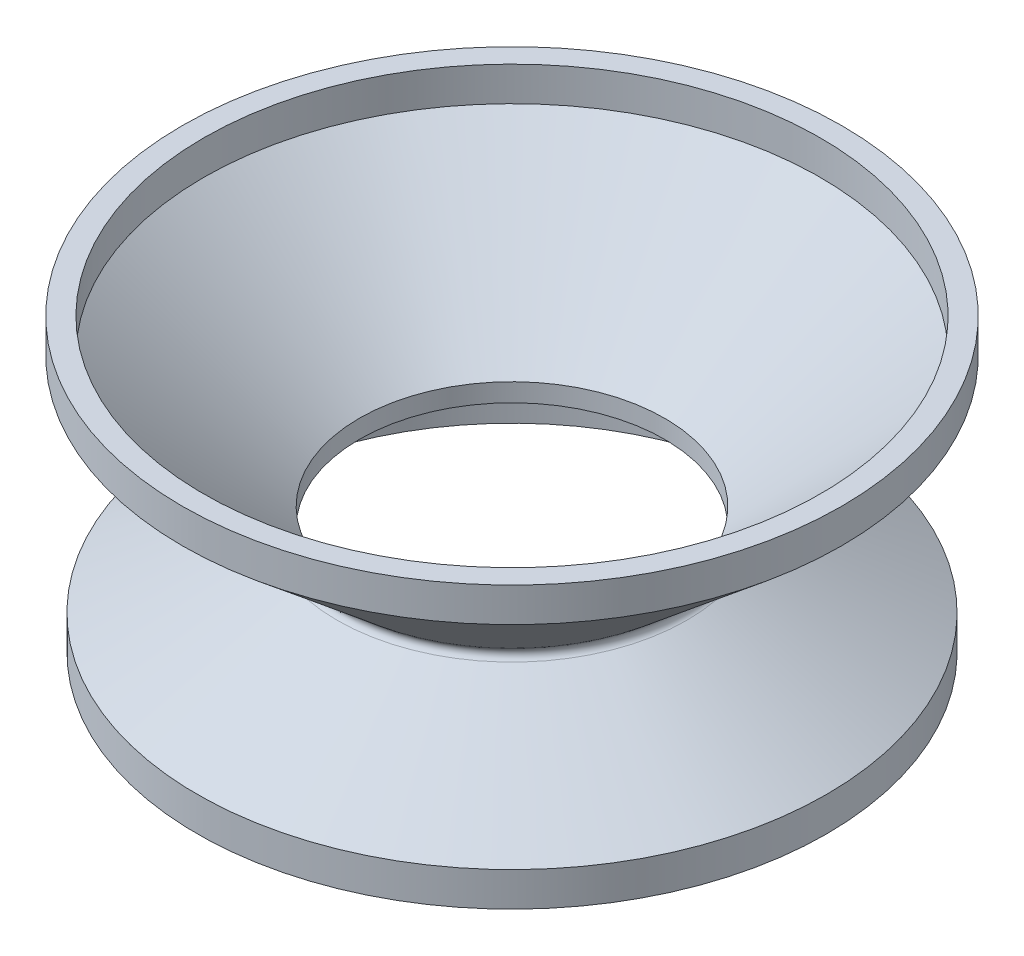
ISO-10303-21;
HEADER;
FILE_DESCRIPTION(('STEP AP214'),'2;1');
FILE_NAME('part.step','',(''),(''),'','','');
FILE_SCHEMA(('AUTOMOTIVE_DESIGN { 1 0 10303 214 1 1 1 1 }'));
ENDSEC;
DATA;
#1=APPLICATION_CONTEXT('core data for automotive mechanical design processes');
#2=APPLICATION_PROTOCOL_DEFINITION('international standard','automotive_design',2000,#1);
#3=PRODUCT_CONTEXT('',#1,'mechanical');
#4=PRODUCT('Part','Part','',(#3));
#5=PRODUCT_RELATED_PRODUCT_CATEGORY('part','',(#4));
#6=PRODUCT_DEFINITION_FORMATION('','',#4);
#7=PRODUCT_DEFINITION_CONTEXT('part definition',#1,'design');
#8=PRODUCT_DEFINITION('design','',#6,#7);
#9=PRODUCT_DEFINITION_SHAPE('','',#8);
#10=(LENGTH_UNIT() NAMED_UNIT(*) SI_UNIT(.MILLI.,.METRE.));
#11=(NAMED_UNIT(*) PLANE_ANGLE_UNIT() SI_UNIT($,.RADIAN.));
#12=(NAMED_UNIT(*) SI_UNIT($,.STERADIAN.) SOLID_ANGLE_UNIT());
#13=UNCERTAINTY_MEASURE_WITH_UNIT(LENGTH_MEASURE(1.E-05),#10,'distance_accuracy_value','');
#14=(GEOMETRIC_REPRESENTATION_CONTEXT(3) GLOBAL_UNCERTAINTY_ASSIGNED_CONTEXT((#13)) GLOBAL_UNIT_ASSIGNED_CONTEXT((#10,
#11,#12)) REPRESENTATION_CONTEXT('',''));
#15=CARTESIAN_POINT('',(0.,0.,0.));
#16=DIRECTION('',(0.,0.,1.));
#17=DIRECTION('',(1.,0.,0.));
#18=AXIS2_PLACEMENT_3D('',#15,#16,#17);
#19=CARTESIAN_POINT('',(10.3733322733685,0.,0.));
#20=DIRECTION('',(0.,-1.,0.));
#21=DIRECTION('',(1.,0.,0.));
#22=AXIS2_PLACEMENT_3D('',#19,#20,#21);
#23=CONICAL_SURFACE('',#22,9.71055032073455,1.0471975511966);
#24=CARTESIAN_POINT('',(10.3733322733685,-0.285629601348422,0.));
#25=DIRECTION('',(0.,-1.,0.));
#26=DIRECTION('',(1.,0.,0.));
#27=AXIS2_PLACEMENT_3D('',#24,#25,#26);
#28=CIRCLE('',#27,10.2052753024157);
#29=CARTESIAN_POINT('',(20.5786075757842,-0.28562960134842,0.));
#30=VERTEX_POINT('',#29);
#31=EDGE_CURVE('E10',#30,#30,#28,.T.);
#32=ORIENTED_EDGE('',*,*,#31,.T.);
#33=EDGE_LOOP('',(#32));
#34=FACE_BOUND('',#33,.T.);
#35=CARTESIAN_POINT('',(10.3733322733685,-5.,0.));
#36=DIRECTION('',(0.,-1.,0.));
#37=DIRECTION('',(1.,0.,0.));
#38=AXIS2_PLACEMENT_3D('',#35,#36,#37);
#39=CIRCLE('',#38,18.3708043585791);
#40=CARTESIAN_POINT('',(28.7441366319476,-5.,0.));
#41=VERTEX_POINT('',#40);
#42=EDGE_CURVE('E88',#41,#41,#39,.T.);
#43=ORIENTED_EDGE('',*,*,#42,.F.);
#44=EDGE_LOOP('',(#43));
#45=FACE_BOUND('',#44,.T.);
#46=ADVANCED_FACE('F43',(#34,#45),#23,.T.);
#47=CARTESIAN_POINT('',(10.3733322733685,8.,0.));
#48=DIRECTION('',(0.,1.,0.));
#49=DIRECTION('',(-1.,0.,0.));
#50=AXIS2_PLACEMENT_3D('',#47,#48,#49);
#51=CONICAL_SURFACE('',#50,19.2445790614883,0.87266462599717);
#52=CARTESIAN_POINT('',(10.3733322733685,0.367198337412949,0.));
#53=DIRECTION('',(0.,1.,0.));
#54=DIRECTION('',(-1.,0.,0.));
#55=AXIS2_PLACEMENT_3D('',#52,#53,#54);
#56=CIRCLE('',#55,10.148160258541);
#57=CARTESIAN_POINT('',(0.225172014827461,0.367198337412948,0.));
#58=VERTEX_POINT('',#57);
#59=EDGE_CURVE('E51',#58,#58,#56,.T.);
#60=ORIENTED_EDGE('',*,*,#59,.T.);
#61=EDGE_LOOP('',(#60));
#62=FACE_BOUND('',#61,.T.);
#63=CARTESIAN_POINT('',(10.3733322733685,8.,0.));
#64=DIRECTION('',(0.,1.,0.));
#65=DIRECTION('',(-1.,0.,0.));
#66=AXIS2_PLACEMENT_3D('',#63,#64,#65);
#67=CIRCLE('',#66,19.2445790614883);
#68=CARTESIAN_POINT('',(-8.87124678811982,8.,0.));
#69=VERTEX_POINT('',#68);
#70=EDGE_CURVE('E56',#69,#69,#67,.T.);
#71=ORIENTED_EDGE('',*,*,#70,.F.);
#72=EDGE_LOOP('',(#71));
#73=FACE_BOUND('',#72,.T.);
#74=ADVANCED_FACE('F120',(#62,#73),#51,.T.);
#75=CARTESIAN_POINT('',(10.3733322733685,0.373046126524003,0.));
#76=DIRECTION('',(0.,1.,0.));
#77=DIRECTION('',(-1.,0.,0.));
#78=AXIS2_PLACEMENT_3D('',#75,#76,#77);
#79=CONICAL_SURFACE('',#78,8.91055032073455,0.872664625997171);
#80=CARTESIAN_POINT('',(10.3733322733685,8.,0.));
#81=DIRECTION('',(0.,1.,0.));
#82=DIRECTION('',(-1.,0.,0.));
#83=AXIS2_PLACEMENT_3D('',#80,#81,#82);
#84=CIRCLE('',#83,18.);
#85=CARTESIAN_POINT('',(-7.62666772663149,8.,0.));
#86=VERTEX_POINT('',#85);
#87=EDGE_CURVE('E80',#86,#86,#84,.T.);
#88=ORIENTED_EDGE('',*,*,#87,.T.);
#89=EDGE_LOOP('',(#88));
#90=FACE_BOUND('',#89,.T.);
#91=CARTESIAN_POINT('',(10.3733322733685,0.373046126524003,0.));
#92=DIRECTION('',(0.,1.,0.));
#93=DIRECTION('',(-1.,0.,0.));
#94=AXIS2_PLACEMENT_3D('',#91,#92,#93);
#95=CIRCLE('',#94,8.91055032073455);
#96=CARTESIAN_POINT('',(1.46278195263397,0.373046126524002,0.));
#97=VERTEX_POINT('',#96);
#98=EDGE_CURVE('E61',#97,#97,#95,.T.);
#99=ORIENTED_EDGE('',*,*,#98,.F.);
#100=EDGE_LOOP('',(#99));
#101=FACE_BOUND('',#100,.T.);
#102=ADVANCED_FACE('F125',(#90,#101),#79,.F.);
#103=CARTESIAN_POINT('',(10.3733322733685,7.60901803281972,0.));
#104=DIRECTION('',(0.,1.,0.));
#105=DIRECTION('',(-1.,0.,0.));
#106=AXIS2_PLACEMENT_3D('',#103,#104,#105);
#107=CYLINDRICAL_SURFACE('',#106,8.91055032073455);
#108=ORIENTED_EDGE('',*,*,#98,.T.);
#109=EDGE_LOOP('',(#108));
#110=FACE_BOUND('',#109,.T.);
#111=CARTESIAN_POINT('',(10.3733322733685,-0.692820323027551,0.));
#112=DIRECTION('',(0.,1.,0.));
#113=DIRECTION('',(-1.,0.,0.));
#114=AXIS2_PLACEMENT_3D('',#111,#112,#113);
#115=CIRCLE('',#114,8.91055032073455);
#116=CARTESIAN_POINT('',(1.46278195263397,-0.692820323027552,0.));
#117=VERTEX_POINT('',#116);
#118=EDGE_CURVE('E67',#117,#117,#115,.T.);
#119=ORIENTED_EDGE('',*,*,#118,.F.);
#120=EDGE_LOOP('',(#119));
#121=FACE_BOUND('',#120,.T.);
#122=ADVANCED_FACE('F131',(#110,#121),#107,.F.);
#123=CARTESIAN_POINT('',(10.3733322733685,-5.,0.));
#124=DIRECTION('',(0.,-1.,0.));
#125=DIRECTION('',(1.,0.,0.));
#126=AXIS2_PLACEMENT_3D('',#123,#124,#125);
#127=CONICAL_SURFACE('',#126,16.370804358579,1.0471975511966);
#128=ORIENTED_EDGE('',*,*,#118,.T.);
#129=EDGE_LOOP('',(#128));
#130=FACE_BOUND('',#129,.T.);
#131=CARTESIAN_POINT('',(10.3733322733685,-5.,0.));
#132=DIRECTION('',(0.,1.,0.));
#133=DIRECTION('',(-1.,0.,0.));
#134=AXIS2_PLACEMENT_3D('',#131,#132,#133);
#135=CIRCLE('',#134,16.370804358579);
#136=CARTESIAN_POINT('',(-5.99747208521052,-5.,0.));
#137=VERTEX_POINT('',#136);
#138=EDGE_CURVE('E71',#137,#137,#135,.T.);
#139=ORIENTED_EDGE('',*,*,#138,.F.);
#140=EDGE_LOOP('',(#139));
#141=FACE_BOUND('',#140,.T.);
#142=ADVANCED_FACE('F135',(#130,#141),#127,.F.);
#143=CARTESIAN_POINT('',(10.3733322733685,0.0607805601653549,0.));
#144=DIRECTION('',(0.,1.,0.));
#145=DIRECTION('',(-1.,0.,0.));
#146=AXIS2_PLACEMENT_3D('',#143,#144,#145);
#147=TOROIDAL_SURFACE('',#146,10.4052753024157,0.4);
#148=ORIENTED_EDGE('',*,*,#31,.F.);
#149=EDGE_LOOP('',(#148));
#150=FACE_BOUND('',#149,.T.);
#151=ORIENTED_EDGE('',*,*,#59,.F.);
#152=EDGE_LOOP('',(#151));
#153=FACE_BOUND('',#152,.T.);
#154=ADVANCED_FACE('F45',(#150,#153),#147,.F.);
#155=CARTESIAN_POINT('',(10.3733322733685,10.,0.));
#156=DIRECTION('',(0.,1.,0.));
#157=DIRECTION('',(-1.,0.,0.));
#158=AXIS2_PLACEMENT_3D('',#155,#156,#157);
#159=PLANE('',#158);
#160=CARTESIAN_POINT('',(10.3733322733685,10.,0.));
#161=DIRECTION('',(0.,1.,0.));
#162=DIRECTION('',(-1.,0.,0.));
#163=AXIS2_PLACEMENT_3D('',#160,#161,#162);
#164=CIRCLE('',#163,19.2445790614883);
#165=CARTESIAN_POINT('',(-8.87124678811982,10.,0.));
#166=VERTEX_POINT('',#165);
#167=EDGE_CURVE('E75',#166,#166,#164,.T.);
#168=ORIENTED_EDGE('',*,*,#167,.T.);
#169=EDGE_LOOP('',(#168));
#170=FACE_BOUND('',#169,.T.);
#171=CARTESIAN_POINT('',(10.3733322733685,10.,0.));
#172=DIRECTION('',(0.,1.,0.));
#173=DIRECTION('',(-1.,0.,0.));
#174=AXIS2_PLACEMENT_3D('',#171,#172,#173);
#175=CIRCLE('',#174,18.);
#176=CARTESIAN_POINT('',(-7.62666772663149,10.,0.));
#177=VERTEX_POINT('',#176);
#178=EDGE_CURVE('E79',#177,#177,#175,.T.);
#179=ORIENTED_EDGE('',*,*,#178,.F.);
#180=EDGE_LOOP('',(#179));
#181=FACE_BOUND('',#180,.T.);
#182=ADVANCED_FACE('F141',(#170,#181),#159,.T.);
#183=CARTESIAN_POINT('',(10.3733322733685,10.,0.));
#184=DIRECTION('',(0.,-1.,0.));
#185=DIRECTION('',(1.,0.,0.));
#186=AXIS2_PLACEMENT_3D('',#183,#184,#185);
#187=CYLINDRICAL_SURFACE('',#186,19.2445790614883);
#188=ORIENTED_EDGE('',*,*,#167,.F.);
#189=EDGE_LOOP('',(#188));
#190=FACE_BOUND('',#189,.T.);
#191=ORIENTED_EDGE('',*,*,#70,.T.);
#192=EDGE_LOOP('',(#191));
#193=FACE_BOUND('',#192,.T.);
#194=ADVANCED_FACE('F115',(#190,#193),#187,.T.);
#195=CARTESIAN_POINT('',(10.3733322733685,10.,0.));
#196=DIRECTION('',(0.,-1.,0.));
#197=DIRECTION('',(1.,0.,0.));
#198=AXIS2_PLACEMENT_3D('',#195,#196,#197);
#199=CYLINDRICAL_SURFACE('',#198,18.);
#200=ORIENTED_EDGE('',*,*,#178,.T.);
#201=EDGE_LOOP('',(#200));
#202=FACE_BOUND('',#201,.T.);
#203=ORIENTED_EDGE('',*,*,#87,.F.);
#204=EDGE_LOOP('',(#203));
#205=FACE_BOUND('',#204,.T.);
#206=ADVANCED_FACE('F106',(#202,#205),#199,.F.);
#207=CARTESIAN_POINT('',(10.3733322733685,-6.99999999999999,0.));
#208=DIRECTION('',(0.,-1.,0.));
#209=DIRECTION('',(1.,0.,0.));
#210=AXIS2_PLACEMENT_3D('',#207,#208,#209);
#211=PLANE('',#210);
#212=CARTESIAN_POINT('',(10.3733322733685,-6.99999999999999,0.));
#213=DIRECTION('',(0.,-1.,0.));
#214=DIRECTION('',(1.,0.,0.));
#215=AXIS2_PLACEMENT_3D('',#212,#213,#214);
#216=CIRCLE('',#215,18.3708043585791);
#217=CARTESIAN_POINT('',(28.7441366319476,-6.99999999999999,0.));
#218=VERTEX_POINT('',#217);
#219=EDGE_CURVE('E84',#218,#218,#216,.T.);
#220=ORIENTED_EDGE('',*,*,#219,.T.);
#221=EDGE_LOOP('',(#220));
#222=FACE_BOUND('',#221,.T.);
#223=CARTESIAN_POINT('',(10.3733322733685,-6.99999999999999,0.));
#224=DIRECTION('',(0.,-1.,0.));
#225=DIRECTION('',(1.,0.,0.));
#226=AXIS2_PLACEMENT_3D('',#223,#224,#225);
#227=CIRCLE('',#226,16.370804358579);
#228=CARTESIAN_POINT('',(26.7441366319475,-6.99999999999999,0.));
#229=VERTEX_POINT('',#228);
#230=EDGE_CURVE('E92',#229,#229,#227,.T.);
#231=ORIENTED_EDGE('',*,*,#230,.F.);
#232=EDGE_LOOP('',(#231));
#233=FACE_BOUND('',#232,.T.);
#234=ADVANCED_FACE('F103',(#222,#233),#211,.T.);
#235=CARTESIAN_POINT('',(10.3733322733685,-6.99999999999999,0.));
#236=DIRECTION('',(0.,1.,0.));
#237=DIRECTION('',(-1.,0.,0.));
#238=AXIS2_PLACEMENT_3D('',#235,#236,#237);
#239=CYLINDRICAL_SURFACE('',#238,18.3708043585791);
#240=ORIENTED_EDGE('',*,*,#219,.F.);
#241=EDGE_LOOP('',(#240));
#242=FACE_BOUND('',#241,.T.);
#243=ORIENTED_EDGE('',*,*,#42,.T.);
#244=EDGE_LOOP('',(#243));
#245=FACE_BOUND('',#244,.T.);
#246=ADVANCED_FACE('F105',(#242,#245),#239,.T.);
#247=CARTESIAN_POINT('',(10.3733322733685,-6.99999999999999,0.));
#248=DIRECTION('',(0.,1.,0.));
#249=DIRECTION('',(-1.,0.,0.));
#250=AXIS2_PLACEMENT_3D('',#247,#248,#249);
#251=CYLINDRICAL_SURFACE('',#250,16.370804358579);
#252=ORIENTED_EDGE('',*,*,#230,.T.);
#253=EDGE_LOOP('',(#252));
#254=FACE_BOUND('',#253,.T.);
#255=ORIENTED_EDGE('',*,*,#138,.T.);
#256=EDGE_LOOP('',(#255));
#257=FACE_BOUND('',#256,.T.);
#258=ADVANCED_FACE('F100',(#254,#257),#251,.F.);
#259=CLOSED_SHELL('',(#46,#74,#102,#122,#142,#154,#182,#194,#206,#234,#246,#258));
#260=MANIFOLD_SOLID_BREP('B2',#259);
#261=ADVANCED_BREP_SHAPE_REPRESENTATION('',(#18,#260),#14);
#262=SHAPE_DEFINITION_REPRESENTATION(#9,#261);
ENDSEC;
END-ISO-10303-21;
